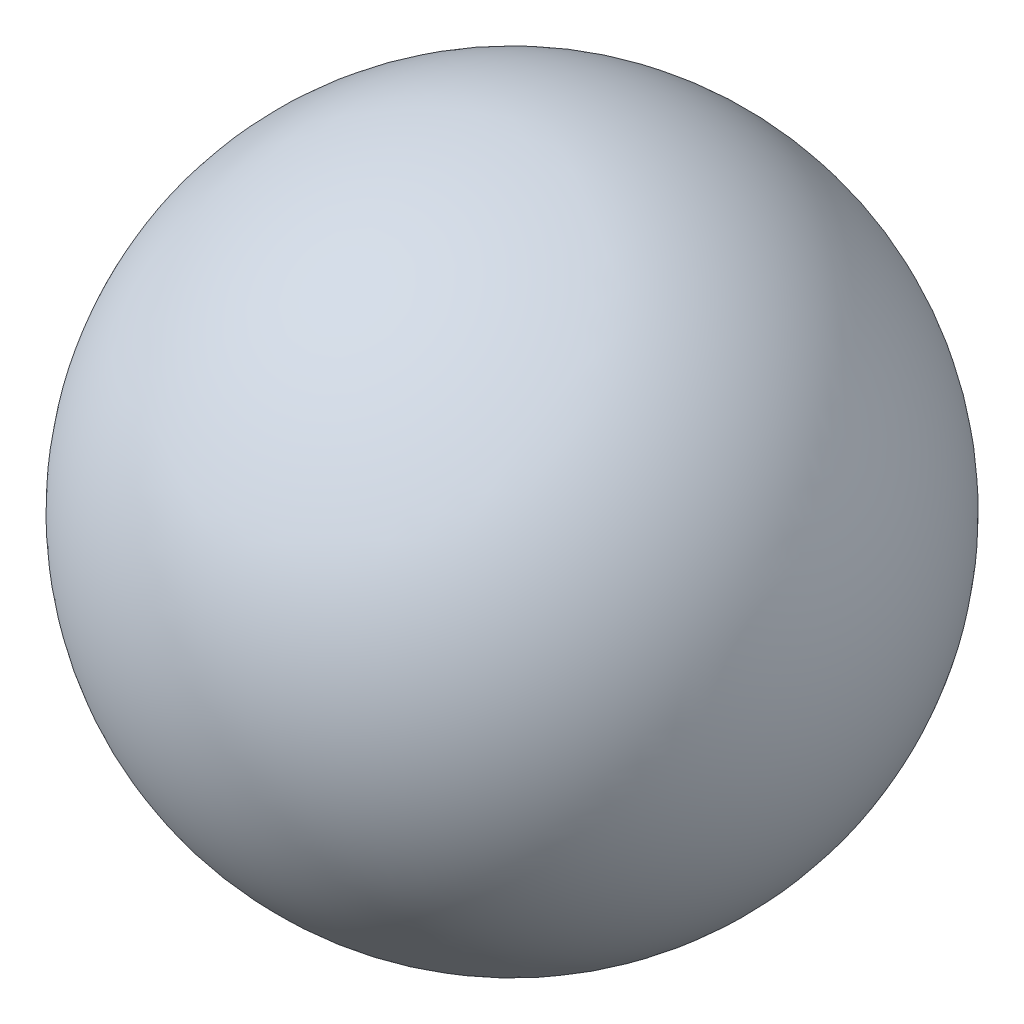
ISO-10303-21;
HEADER;
FILE_DESCRIPTION(('STEP AP214'),'2;1');
FILE_NAME('part.step','',(''),(''),'','','');
FILE_SCHEMA(('AUTOMOTIVE_DESIGN { 1 0 10303 214 1 1 1 1 }'));
ENDSEC;
DATA;
#1=APPLICATION_CONTEXT('core data for automotive mechanical design processes');
#2=APPLICATION_PROTOCOL_DEFINITION('international standard','automotive_design',2000,#1);
#3=PRODUCT_CONTEXT('',#1,'mechanical');
#4=PRODUCT('Part','Part','',(#3));
#5=PRODUCT_RELATED_PRODUCT_CATEGORY('part','',(#4));
#6=PRODUCT_DEFINITION_FORMATION('','',#4);
#7=PRODUCT_DEFINITION_CONTEXT('part definition',#1,'design');
#8=PRODUCT_DEFINITION('design','',#6,#7);
#9=PRODUCT_DEFINITION_SHAPE('','',#8);
#10=(LENGTH_UNIT() NAMED_UNIT(*) SI_UNIT(.MILLI.,.METRE.));
#11=(NAMED_UNIT(*) PLANE_ANGLE_UNIT() SI_UNIT($,.RADIAN.));
#12=(NAMED_UNIT(*) SI_UNIT($,.STERADIAN.) SOLID_ANGLE_UNIT());
#13=UNCERTAINTY_MEASURE_WITH_UNIT(LENGTH_MEASURE(1.E-05),#10,'distance_accuracy_value','');
#14=(GEOMETRIC_REPRESENTATION_CONTEXT(3) GLOBAL_UNCERTAINTY_ASSIGNED_CONTEXT((#13)) GLOBAL_UNIT_ASSIGNED_CONTEXT((#10,
#11,#12)) REPRESENTATION_CONTEXT('',''));
#15=CARTESIAN_POINT('',(0.,0.,0.));
#16=DIRECTION('',(0.,0.,1.));
#17=DIRECTION('',(1.,0.,0.));
#18=AXIS2_PLACEMENT_3D('',#15,#16,#17);
#19=CARTESIAN_POINT('',(0.,0.,0.));
#20=DIRECTION('',(1.,0.,0.));
#21=DIRECTION('',(0.,-1.,0.));
#22=AXIS2_PLACEMENT_3D('',#19,#20,#21);
#23=SPHERICAL_SURFACE('',#22,12.);
#24=CARTESIAN_POINT('',(12.,0.,0.));
#25=VERTEX_POINT('',#24);
#26=VERTEX_LOOP('',#25);
#27=FACE_BOUND('',#26,.T.);
#28=ADVANCED_FACE('F33',(#27),#23,.T.);
#29=CLOSED_SHELL('',(#28));
#30=MANIFOLD_SOLID_BREP('B2',#29);
#31=ADVANCED_BREP_SHAPE_REPRESENTATION('',(#18,#30),#14);
#32=SHAPE_DEFINITION_REPRESENTATION(#9,#31);
ENDSEC;
END-ISO-10303-21;
